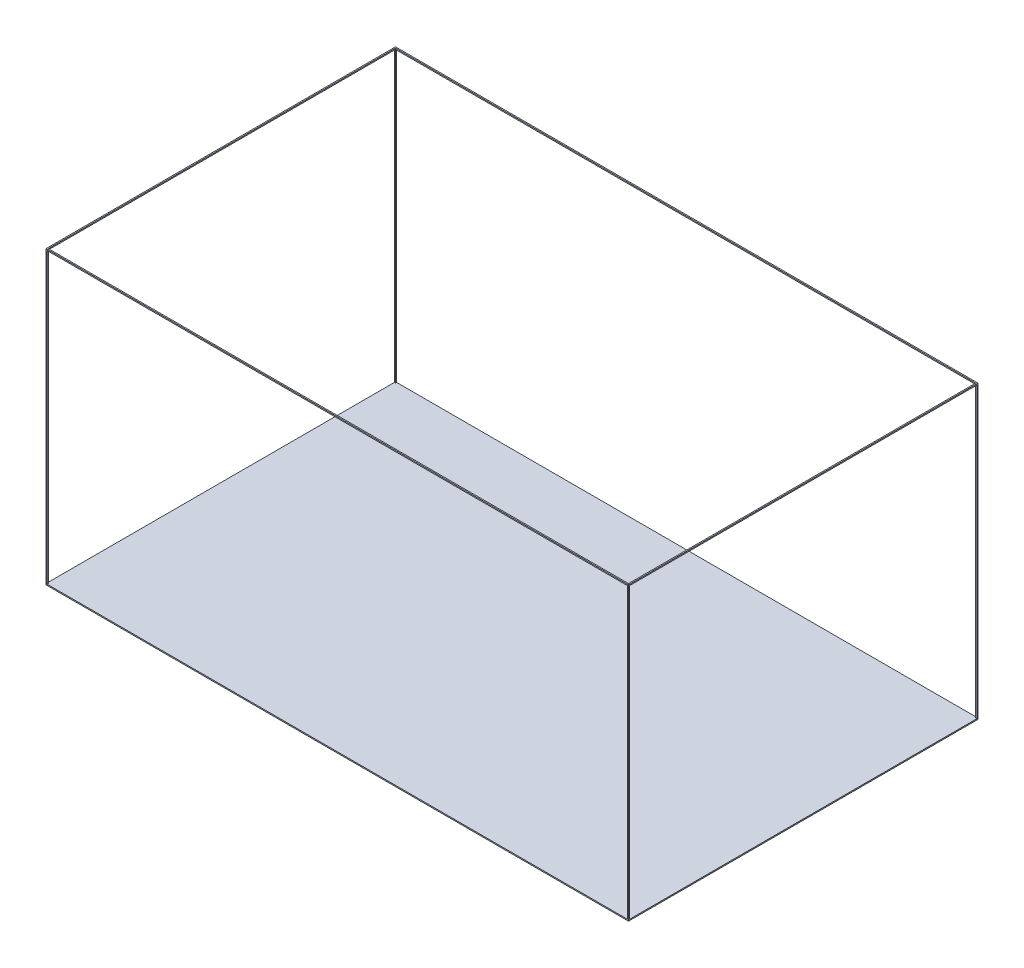
ISO-10303-21;
HEADER;
FILE_DESCRIPTION(('STEP AP214'),'2;1');
FILE_NAME('part.step','',(''),(''),'','','');
FILE_SCHEMA(('AUTOMOTIVE_DESIGN { 1 0 10303 214 1 1 1 1 }'));
ENDSEC;
DATA;
#1=APPLICATION_CONTEXT('core data for automotive mechanical design processes');
#2=APPLICATION_PROTOCOL_DEFINITION('international standard','automotive_design',2000,#1);
#3=PRODUCT_CONTEXT('',#1,'mechanical');
#4=PRODUCT('Part','Part','',(#3));
#5=PRODUCT_RELATED_PRODUCT_CATEGORY('part','',(#4));
#6=PRODUCT_DEFINITION_FORMATION('','',#4);
#7=PRODUCT_DEFINITION_CONTEXT('part definition',#1,'design');
#8=PRODUCT_DEFINITION('design','',#6,#7);
#9=PRODUCT_DEFINITION_SHAPE('','',#8);
#10=(LENGTH_UNIT() NAMED_UNIT(*) SI_UNIT(.MILLI.,.METRE.));
#11=(NAMED_UNIT(*) PLANE_ANGLE_UNIT() SI_UNIT($,.RADIAN.));
#12=(NAMED_UNIT(*) SI_UNIT($,.STERADIAN.) SOLID_ANGLE_UNIT());
#13=UNCERTAINTY_MEASURE_WITH_UNIT(LENGTH_MEASURE(1.E-05),#10,'distance_accuracy_value','');
#14=(GEOMETRIC_REPRESENTATION_CONTEXT(3) GLOBAL_UNCERTAINTY_ASSIGNED_CONTEXT((#13)) GLOBAL_UNIT_ASSIGNED_CONTEXT((#10,
#11,#12)) REPRESENTATION_CONTEXT('',''));
#15=CARTESIAN_POINT('',(0.,0.,0.));
#16=DIRECTION('',(0.,0.,1.));
#17=DIRECTION('',(1.,0.,0.));
#18=AXIS2_PLACEMENT_3D('',#15,#16,#17);
#19=CARTESIAN_POINT('',(-2490.,2500.,1500.));
#20=DIRECTION('',(1.,0.,0.));
#21=DIRECTION('',(0.,0.,-1.));
#22=AXIS2_PLACEMENT_3D('',#19,#20,#21);
#23=PLANE('',#22);
#24=DIRECTION('',(0.,-1.,0.));
#25=VECTOR('',#24,1.);
#26=CARTESIAN_POINT('',(-2490.,2500.,1490.));
#27=LINE('',#26,#25);
#28=CARTESIAN_POINT('',(-2490.,2490.,1490.));
#29=VERTEX_POINT('',#28);
#30=CARTESIAN_POINT('',(-2490.,9.99999999999979,1490.));
#31=VERTEX_POINT('',#30);
#32=EDGE_CURVE('E172',#29,#31,#27,.T.);
#33=ORIENTED_EDGE('',*,*,#32,.F.);
#34=DIRECTION('',(0.,0.,1.));
#35=VECTOR('',#34,1.);
#36=CARTESIAN_POINT('',(-2490.,2490.,-1500.));
#37=LINE('',#36,#35);
#38=CARTESIAN_POINT('',(-2490.,2490.,1500.));
#39=VERTEX_POINT('',#38);
#40=EDGE_CURVE('E278',#29,#39,#37,.T.);
#41=ORIENTED_EDGE('',*,*,#40,.T.);
#42=DIRECTION('',(0.,-1.,0.));
#43=VECTOR('',#42,1.);
#44=CARTESIAN_POINT('',(-2490.,2490.,1500.));
#45=LINE('',#44,#43);
#46=CARTESIAN_POINT('',(-2490.,9.99999999999979,1500.));
#47=VERTEX_POINT('',#46);
#48=EDGE_CURVE('E240',#39,#47,#45,.T.);
#49=ORIENTED_EDGE('',*,*,#48,.T.);
#50=DIRECTION('',(0.,0.,1.));
#51=VECTOR('',#50,1.);
#52=CARTESIAN_POINT('',(-2490.,9.99999999999979,1500.));
#53=LINE('',#52,#51);
#54=EDGE_CURVE('E286',#31,#47,#53,.T.);
#55=ORIENTED_EDGE('',*,*,#54,.F.);
#56=EDGE_LOOP('',(#33,#41,#49,#55));
#57=FACE_BOUND('',#56,.T.);
#58=ADVANCED_FACE('F38',(#57),#23,.T.);
#59=DIRECTION('',(0.,0.,1.));
#60=VECTOR('',#59,1.);
#61=CARTESIAN_POINT('',(-2490.,2490.,1500.));
#62=LINE('',#61,#60);
#63=CARTESIAN_POINT('',(-2490.,2490.,-1490.));
#64=VERTEX_POINT('',#63);
#65=EDGE_CURVE('E237',#64,#29,#62,.T.);
#66=ORIENTED_EDGE('',*,*,#65,.F.);
#67=DIRECTION('',(0.,-1.,0.));
#68=VECTOR('',#67,1.);
#69=CARTESIAN_POINT('',(-2490.,2500.,-1490.));
#70=LINE('',#69,#68);
#71=CARTESIAN_POINT('',(-2490.,2500.,-1490.));
#72=VERTEX_POINT('',#71);
#73=EDGE_CURVE('E297',#72,#64,#70,.T.);
#74=ORIENTED_EDGE('',*,*,#73,.F.);
#75=DIRECTION('',(0.,0.,1.));
#76=VECTOR('',#75,1.);
#77=CARTESIAN_POINT('',(-2490.,2500.,1500.));
#78=LINE('',#77,#76);
#79=CARTESIAN_POINT('',(-2490.,2500.,1490.));
#80=VERTEX_POINT('',#79);
#81=EDGE_CURVE('E310',#72,#80,#78,.T.);
#82=ORIENTED_EDGE('',*,*,#81,.T.);
#83=DIRECTION('',(0.,-1.,0.));
#84=VECTOR('',#83,1.);
#85=CARTESIAN_POINT('',(-2490.,2500.,1490.));
#86=LINE('',#85,#84);
#87=EDGE_CURVE('E291',#80,#29,#86,.T.);
#88=ORIENTED_EDGE('',*,*,#87,.T.);
#89=EDGE_LOOP('',(#66,#74,#82,#88));
#90=FACE_BOUND('',#89,.T.);
#91=ADVANCED_FACE('F397',(#90),#23,.T.);
#92=CARTESIAN_POINT('',(2490.,2500.,1500.));
#93=DIRECTION('',(-1.,0.,0.));
#94=DIRECTION('',(0.,0.,1.));
#95=AXIS2_PLACEMENT_3D('',#92,#93,#94);
#96=PLANE('',#95);
#97=DIRECTION('',(0.,1.,0.));
#98=VECTOR('',#97,1.);
#99=CARTESIAN_POINT('',(2490.,2500.,1490.));
#100=LINE('',#99,#98);
#101=CARTESIAN_POINT('',(2490.,10.,1490.));
#102=VERTEX_POINT('',#101);
#103=CARTESIAN_POINT('',(2490.,2490.,1490.));
#104=VERTEX_POINT('',#103);
#105=EDGE_CURVE('E214',#102,#104,#100,.T.);
#106=ORIENTED_EDGE('',*,*,#105,.F.);
#107=DIRECTION('',(0.,0.,-1.));
#108=VECTOR('',#107,1.);
#109=CARTESIAN_POINT('',(2490.,9.99999999999979,1500.));
#110=LINE('',#109,#108);
#111=CARTESIAN_POINT('',(2490.,10.,1500.));
#112=VERTEX_POINT('',#111);
#113=EDGE_CURVE('E306',#112,#102,#110,.T.);
#114=ORIENTED_EDGE('',*,*,#113,.F.);
#115=DIRECTION('',(0.,1.,0.));
#116=VECTOR('',#115,1.);
#117=CARTESIAN_POINT('',(2490.,10.,1500.));
#118=LINE('',#117,#116);
#119=CARTESIAN_POINT('',(2490.,2490.,1500.));
#120=VERTEX_POINT('',#119);
#121=EDGE_CURVE('E266',#112,#120,#118,.T.);
#122=ORIENTED_EDGE('',*,*,#121,.T.);
#123=DIRECTION('',(0.,0.,1.));
#124=VECTOR('',#123,1.);
#125=CARTESIAN_POINT('',(2490.,2490.,-1500.));
#126=LINE('',#125,#124);
#127=EDGE_CURVE('E258',#104,#120,#126,.T.);
#128=ORIENTED_EDGE('',*,*,#127,.F.);
#129=EDGE_LOOP('',(#106,#114,#122,#128));
#130=FACE_BOUND('',#129,.T.);
#131=ADVANCED_FACE('F403',(#130),#96,.T.);
#132=DIRECTION('',(0.,0.,-1.));
#133=VECTOR('',#132,1.);
#134=CARTESIAN_POINT('',(2490.,2490.,1500.));
#135=LINE('',#134,#133);
#136=CARTESIAN_POINT('',(2490.,2490.,-1490.));
#137=VERTEX_POINT('',#136);
#138=EDGE_CURVE('E234',#104,#137,#135,.T.);
#139=ORIENTED_EDGE('',*,*,#138,.F.);
#140=DIRECTION('',(0.,-1.,0.));
#141=VECTOR('',#140,1.);
#142=CARTESIAN_POINT('',(2490.,2500.,1490.));
#143=LINE('',#142,#141);
#144=CARTESIAN_POINT('',(2490.,2500.,1490.));
#145=VERTEX_POINT('',#144);
#146=EDGE_CURVE('E296',#145,#104,#143,.T.);
#147=ORIENTED_EDGE('',*,*,#146,.F.);
#148=DIRECTION('',(0.,0.,-1.));
#149=VECTOR('',#148,1.);
#150=CARTESIAN_POINT('',(2490.,2500.,1500.));
#151=LINE('',#150,#149);
#152=CARTESIAN_POINT('',(2490.,2500.,-1490.));
#153=VERTEX_POINT('',#152);
#154=EDGE_CURVE('E319',#145,#153,#151,.T.);
#155=ORIENTED_EDGE('',*,*,#154,.T.);
#156=DIRECTION('',(0.,-1.,0.));
#157=VECTOR('',#156,1.);
#158=CARTESIAN_POINT('',(2490.,2500.,-1490.));
#159=LINE('',#158,#157);
#160=EDGE_CURVE('E301',#153,#137,#159,.T.);
#161=ORIENTED_EDGE('',*,*,#160,.T.);
#162=EDGE_LOOP('',(#139,#147,#155,#161));
#163=FACE_BOUND('',#162,.T.);
#164=ADVANCED_FACE('F429',(#163),#96,.T.);
#165=CARTESIAN_POINT('',(-2500.,2500.,1500.));
#166=DIRECTION('',(1.,0.,0.));
#167=DIRECTION('',(0.,0.,-1.));
#168=AXIS2_PLACEMENT_3D('',#165,#166,#167);
#169=PLANE('',#168);
#170=DIRECTION('',(0.,0.,1.));
#171=VECTOR('',#170,1.);
#172=CARTESIAN_POINT('',(-2500.,2490.,-1490.));
#173=LINE('',#172,#171);
#174=CARTESIAN_POINT('',(-2500.,2490.,-1490.));
#175=VERTEX_POINT('',#174);
#176=CARTESIAN_POINT('',(-2500.,2490.,1490.));
#177=VERTEX_POINT('',#176);
#178=EDGE_CURVE('E189',#175,#177,#173,.T.);
#179=ORIENTED_EDGE('',*,*,#178,.T.);
#180=DIRECTION('',(0.,-1.,0.));
#181=VECTOR('',#180,1.);
#182=CARTESIAN_POINT('',(-2500.,2490.,1490.));
#183=LINE('',#182,#181);
#184=CARTESIAN_POINT('',(-2500.,10.,1490.));
#185=VERTEX_POINT('',#184);
#186=EDGE_CURVE('E169',#177,#185,#183,.T.);
#187=ORIENTED_EDGE('',*,*,#186,.T.);
#188=DIRECTION('',(0.,0.,-1.));
#189=VECTOR('',#188,1.);
#190=CARTESIAN_POINT('',(-2500.,10.,1490.));
#191=LINE('',#190,#189);
#192=CARTESIAN_POINT('',(-2500.,9.99999999999979,-1490.));
#193=VERTEX_POINT('',#192);
#194=EDGE_CURVE('E180',#185,#193,#191,.T.);
#195=ORIENTED_EDGE('',*,*,#194,.T.);
#196=DIRECTION('',(0.,1.,0.));
#197=VECTOR('',#196,1.);
#198=CARTESIAN_POINT('',(-2500.,10.,-1490.));
#199=LINE('',#198,#197);
#200=EDGE_CURVE('E54',#193,#175,#199,.T.);
#201=ORIENTED_EDGE('',*,*,#200,.T.);
#202=EDGE_LOOP('',(#179,#187,#195,#201));
#203=FACE_BOUND('',#202,.T.);
#204=DIRECTION('',(0.,0.,1.));
#205=VECTOR('',#204,1.);
#206=CARTESIAN_POINT('',(-2500.,0.,1500.));
#207=LINE('',#206,#205);
#208=CARTESIAN_POINT('',(-2500.,0.,-1500.));
#209=VERTEX_POINT('',#208);
#210=CARTESIAN_POINT('',(-2500.,0.,1500.));
#211=VERTEX_POINT('',#210);
#212=EDGE_CURVE('E295',#209,#211,#207,.T.);
#213=ORIENTED_EDGE('',*,*,#212,.T.);
#214=DIRECTION('',(0.,-1.,0.));
#215=VECTOR('',#214,1.);
#216=CARTESIAN_POINT('',(-2500.,2500.,1500.));
#217=LINE('',#216,#215);
#218=CARTESIAN_POINT('',(-2500.,2500.,1500.));
#219=VERTEX_POINT('',#218);
#220=EDGE_CURVE('E47',#219,#211,#217,.T.);
#221=ORIENTED_EDGE('',*,*,#220,.F.);
#222=DIRECTION('',(0.,0.,1.));
#223=VECTOR('',#222,1.);
#224=CARTESIAN_POINT('',(-2500.,2500.,1500.));
#225=LINE('',#224,#223);
#226=CARTESIAN_POINT('',(-2500.,2500.,-1500.));
#227=VERTEX_POINT('',#226);
#228=EDGE_CURVE('E325',#227,#219,#225,.T.);
#229=ORIENTED_EDGE('',*,*,#228,.F.);
#230=DIRECTION('',(0.,-1.,0.));
#231=VECTOR('',#230,1.);
#232=CARTESIAN_POINT('',(-2500.,2500.,-1500.));
#233=LINE('',#232,#231);
#234=EDGE_CURVE('E339',#227,#209,#233,.T.);
#235=ORIENTED_EDGE('',*,*,#234,.T.);
#236=EDGE_LOOP('',(#213,#221,#229,#235));
#237=FACE_BOUND('',#236,.T.);
#238=ADVANCED_FACE('F40',(#203,#237),#169,.F.);
#239=CARTESIAN_POINT('',(2500.,2500.,1500.));
#240=DIRECTION('',(0.,0.,-1.));
#241=DIRECTION('',(-1.,0.,0.));
#242=AXIS2_PLACEMENT_3D('',#239,#240,#241);
#243=PLANE('',#242);
#244=DIRECTION('',(1.,0.,0.));
#245=VECTOR('',#244,1.);
#246=CARTESIAN_POINT('',(-2490.,10.,1500.));
#247=LINE('',#246,#245);
#248=EDGE_CURVE('E262',#47,#112,#247,.T.);
#249=ORIENTED_EDGE('',*,*,#248,.F.);
#250=ORIENTED_EDGE('',*,*,#48,.F.);
#251=DIRECTION('',(-1.,0.,0.));
#252=VECTOR('',#251,1.);
#253=CARTESIAN_POINT('',(2490.,2490.,1500.));
#254=LINE('',#253,#252);
#255=EDGE_CURVE('E246',#120,#39,#254,.T.);
#256=ORIENTED_EDGE('',*,*,#255,.F.);
#257=ORIENTED_EDGE('',*,*,#121,.F.);
#258=EDGE_LOOP('',(#249,#250,#256,#257));
#259=FACE_BOUND('',#258,.T.);
#260=DIRECTION('',(1.,0.,0.));
#261=VECTOR('',#260,1.);
#262=CARTESIAN_POINT('',(2500.,0.,1500.));
#263=LINE('',#262,#261);
#264=CARTESIAN_POINT('',(2500.,0.,1500.));
#265=VERTEX_POINT('',#264);
#266=EDGE_CURVE('E343',#211,#265,#263,.T.);
#267=ORIENTED_EDGE('',*,*,#266,.T.);
#268=DIRECTION('',(0.,-1.,0.));
#269=VECTOR('',#268,1.);
#270=CARTESIAN_POINT('',(2500.,2500.,1500.));
#271=LINE('',#270,#269);
#272=CARTESIAN_POINT('',(2500.,2500.,1500.));
#273=VERTEX_POINT('',#272);
#274=EDGE_CURVE('E358',#273,#265,#271,.T.);
#275=ORIENTED_EDGE('',*,*,#274,.F.);
#276=DIRECTION('',(1.,0.,0.));
#277=VECTOR('',#276,1.);
#278=CARTESIAN_POINT('',(2500.,2500.,1500.));
#279=LINE('',#278,#277);
#280=EDGE_CURVE('E329',#219,#273,#279,.T.);
#281=ORIENTED_EDGE('',*,*,#280,.F.);
#282=ORIENTED_EDGE('',*,*,#220,.T.);
#283=EDGE_LOOP('',(#267,#275,#281,#282));
#284=FACE_BOUND('',#283,.T.);
#285=ADVANCED_FACE('F365',(#259,#284),#243,.F.);
#286=CARTESIAN_POINT('',(2500.,2500.,1500.));
#287=DIRECTION('',(-1.,0.,0.));
#288=DIRECTION('',(0.,0.,1.));
#289=AXIS2_PLACEMENT_3D('',#286,#287,#288);
#290=PLANE('',#289);
#291=DIRECTION('',(0.,0.,-1.));
#292=VECTOR('',#291,1.);
#293=CARTESIAN_POINT('',(2500.,10.,1490.));
#294=LINE('',#293,#292);
#295=CARTESIAN_POINT('',(2500.,9.99999999999979,1490.));
#296=VERTEX_POINT('',#295);
#297=CARTESIAN_POINT('',(2500.,10.,-1490.));
#298=VERTEX_POINT('',#297);
#299=EDGE_CURVE('E204',#296,#298,#294,.T.);
#300=ORIENTED_EDGE('',*,*,#299,.F.);
#301=DIRECTION('',(0.,-1.,0.));
#302=VECTOR('',#301,1.);
#303=CARTESIAN_POINT('',(2500.,2490.,1490.));
#304=LINE('',#303,#302);
#305=CARTESIAN_POINT('',(2500.,2490.,1490.));
#306=VERTEX_POINT('',#305);
#307=EDGE_CURVE('E62',#306,#296,#304,.T.);
#308=ORIENTED_EDGE('',*,*,#307,.F.);
#309=DIRECTION('',(0.,0.,1.));
#310=VECTOR('',#309,1.);
#311=CARTESIAN_POINT('',(2500.,2490.,-1490.));
#312=LINE('',#311,#310);
#313=CARTESIAN_POINT('',(2500.,2490.,-1490.));
#314=VERTEX_POINT('',#313);
#315=EDGE_CURVE('E191',#314,#306,#312,.T.);
#316=ORIENTED_EDGE('',*,*,#315,.F.);
#317=DIRECTION('',(0.,1.,0.));
#318=VECTOR('',#317,1.);
#319=CARTESIAN_POINT('',(2500.,10.,-1490.));
#320=LINE('',#319,#318);
#321=EDGE_CURVE('E195',#298,#314,#320,.T.);
#322=ORIENTED_EDGE('',*,*,#321,.F.);
#323=EDGE_LOOP('',(#300,#308,#316,#322));
#324=FACE_BOUND('',#323,.T.);
#325=DIRECTION('',(0.,0.,-1.));
#326=VECTOR('',#325,1.);
#327=CARTESIAN_POINT('',(2500.,0.,1500.));
#328=LINE('',#327,#326);
#329=CARTESIAN_POINT('',(2500.,0.,-1500.));
#330=VERTEX_POINT('',#329);
#331=EDGE_CURVE('E346',#265,#330,#328,.T.);
#332=ORIENTED_EDGE('',*,*,#331,.T.);
#333=DIRECTION('',(0.,-1.,0.));
#334=VECTOR('',#333,1.);
#335=CARTESIAN_POINT('',(2500.,2500.,-1500.));
#336=LINE('',#335,#334);
#337=CARTESIAN_POINT('',(2500.,2500.,-1500.));
#338=VERTEX_POINT('',#337);
#339=EDGE_CURVE('E354',#338,#330,#336,.T.);
#340=ORIENTED_EDGE('',*,*,#339,.F.);
#341=DIRECTION('',(0.,0.,-1.));
#342=VECTOR('',#341,1.);
#343=CARTESIAN_POINT('',(2500.,2500.,1500.));
#344=LINE('',#343,#342);
#345=EDGE_CURVE('E333',#273,#338,#344,.T.);
#346=ORIENTED_EDGE('',*,*,#345,.F.);
#347=ORIENTED_EDGE('',*,*,#274,.T.);
#348=EDGE_LOOP('',(#332,#340,#346,#347));
#349=FACE_BOUND('',#348,.T.);
#350=ADVANCED_FACE('F376',(#324,#349),#290,.F.);
#351=CARTESIAN_POINT('',(2500.,2500.,-1500.));
#352=DIRECTION('',(0.,0.,1.));
#353=DIRECTION('',(1.,0.,0.));
#354=AXIS2_PLACEMENT_3D('',#351,#352,#353);
#355=PLANE('',#354);
#356=DIRECTION('',(-1.,0.,0.));
#357=VECTOR('',#356,1.);
#358=CARTESIAN_POINT('',(2490.,2490.,-1500.));
#359=LINE('',#358,#357);
#360=CARTESIAN_POINT('',(2490.,2490.,-1500.));
#361=VERTEX_POINT('',#360);
#362=CARTESIAN_POINT('',(-2490.,2490.,-1500.));
#363=VERTEX_POINT('',#362);
#364=EDGE_CURVE('E254',#361,#363,#359,.T.);
#365=ORIENTED_EDGE('',*,*,#364,.T.);
#366=DIRECTION('',(0.,-1.,0.));
#367=VECTOR('',#366,1.);
#368=CARTESIAN_POINT('',(-2490.,2490.,-1500.));
#369=LINE('',#368,#367);
#370=CARTESIAN_POINT('',(-2490.,10.,-1500.));
#371=VERTEX_POINT('',#370);
#372=EDGE_CURVE('E241',#363,#371,#369,.T.);
#373=ORIENTED_EDGE('',*,*,#372,.T.);
#374=DIRECTION('',(1.,0.,0.));
#375=VECTOR('',#374,1.);
#376=CARTESIAN_POINT('',(-2490.,10.,-1500.));
#377=LINE('',#376,#375);
#378=CARTESIAN_POINT('',(2490.,9.99999999999979,-1500.));
#379=VERTEX_POINT('',#378);
#380=EDGE_CURVE('E245',#371,#379,#377,.T.);
#381=ORIENTED_EDGE('',*,*,#380,.T.);
#382=DIRECTION('',(0.,1.,0.));
#383=VECTOR('',#382,1.);
#384=CARTESIAN_POINT('',(2490.,10.,-1500.));
#385=LINE('',#384,#383);
#386=EDGE_CURVE('E250',#379,#361,#385,.T.);
#387=ORIENTED_EDGE('',*,*,#386,.T.);
#388=EDGE_LOOP('',(#365,#373,#381,#387));
#389=FACE_BOUND('',#388,.T.);
#390=DIRECTION('',(-1.,0.,0.));
#391=VECTOR('',#390,1.);
#392=CARTESIAN_POINT('',(2500.,0.,-1500.));
#393=LINE('',#392,#391);
#394=EDGE_CURVE('E330',#330,#209,#393,.T.);
#395=ORIENTED_EDGE('',*,*,#394,.T.);
#396=ORIENTED_EDGE('',*,*,#234,.F.);
#397=DIRECTION('',(-1.,0.,0.));
#398=VECTOR('',#397,1.);
#399=CARTESIAN_POINT('',(2500.,2500.,-1500.));
#400=LINE('',#399,#398);
#401=EDGE_CURVE('E336',#338,#227,#400,.T.);
#402=ORIENTED_EDGE('',*,*,#401,.F.);
#403=ORIENTED_EDGE('',*,*,#339,.T.);
#404=EDGE_LOOP('',(#395,#396,#402,#403));
#405=FACE_BOUND('',#404,.T.);
#406=ADVANCED_FACE('F380',(#389,#405),#355,.F.);
#407=CARTESIAN_POINT('',(0.,2500.,0.));
#408=DIRECTION('',(0.,1.,0.));
#409=DIRECTION('',(0.,0.,1.));
#410=AXIS2_PLACEMENT_3D('',#407,#408,#409);
#411=PLANE('',#410);
#412=ORIENTED_EDGE('',*,*,#81,.F.);
#413=DIRECTION('',(-1.,0.,0.));
#414=VECTOR('',#413,1.);
#415=CARTESIAN_POINT('',(2500.,2500.,-1490.));
#416=LINE('',#415,#414);
#417=EDGE_CURVE('E302',#153,#72,#416,.T.);
#418=ORIENTED_EDGE('',*,*,#417,.F.);
#419=ORIENTED_EDGE('',*,*,#154,.F.);
#420=DIRECTION('',(1.,0.,0.));
#421=VECTOR('',#420,1.);
#422=CARTESIAN_POINT('',(2500.,2500.,1490.));
#423=LINE('',#422,#421);
#424=EDGE_CURVE('E316',#80,#145,#423,.T.);
#425=ORIENTED_EDGE('',*,*,#424,.F.);
#426=EDGE_LOOP('',(#412,#418,#419,#425));
#427=FACE_BOUND('',#426,.T.);
#428=ORIENTED_EDGE('',*,*,#228,.T.);
#429=ORIENTED_EDGE('',*,*,#280,.T.);
#430=ORIENTED_EDGE('',*,*,#345,.T.);
#431=ORIENTED_EDGE('',*,*,#401,.T.);
#432=EDGE_LOOP('',(#428,#429,#430,#431));
#433=FACE_BOUND('',#432,.T.);
#434=ADVANCED_FACE('F382',(#427,#433),#411,.T.);
#435=CARTESIAN_POINT('',(0.,0.,0.));
#436=DIRECTION('',(0.,1.,0.));
#437=DIRECTION('',(0.,0.,1.));
#438=AXIS2_PLACEMENT_3D('',#435,#436,#437);
#439=PLANE('',#438);
#440=ORIENTED_EDGE('',*,*,#212,.F.);
#441=ORIENTED_EDGE('',*,*,#394,.F.);
#442=ORIENTED_EDGE('',*,*,#331,.F.);
#443=ORIENTED_EDGE('',*,*,#266,.F.);
#444=EDGE_LOOP('',(#440,#441,#442,#443));
#445=FACE_BOUND('',#444,.T.);
#446=ADVANCED_FACE('F372',(#445),#439,.F.);
#447=DIRECTION('',(0.,1.,0.));
#448=VECTOR('',#447,1.);
#449=CARTESIAN_POINT('',(-2490.,2500.,-1490.));
#450=LINE('',#449,#448);
#451=CARTESIAN_POINT('',(-2490.,10.,-1490.));
#452=VERTEX_POINT('',#451);
#453=EDGE_CURVE('E231',#452,#64,#450,.T.);
#454=ORIENTED_EDGE('',*,*,#453,.F.);
#455=EDGE_CURVE('E287',#371,#452,#53,.T.);
#456=ORIENTED_EDGE('',*,*,#455,.F.);
#457=ORIENTED_EDGE('',*,*,#372,.F.);
#458=EDGE_CURVE('E273',#363,#64,#37,.T.);
#459=ORIENTED_EDGE('',*,*,#458,.T.);
#460=EDGE_LOOP('',(#454,#456,#457,#459));
#461=FACE_BOUND('',#460,.T.);
#462=ADVANCED_FACE('F390',(#461),#23,.T.);
#463=CARTESIAN_POINT('',(2500.,2500.,1490.));
#464=DIRECTION('',(0.,0.,-1.));
#465=DIRECTION('',(-1.,0.,0.));
#466=AXIS2_PLACEMENT_3D('',#463,#464,#465);
#467=PLANE('',#466);
#468=DIRECTION('',(1.,0.,0.));
#469=VECTOR('',#468,1.);
#470=CARTESIAN_POINT('',(2500.,2490.,1490.));
#471=LINE('',#470,#469);
#472=EDGE_CURVE('E277',#29,#104,#471,.T.);
#473=ORIENTED_EDGE('',*,*,#472,.F.);
#474=ORIENTED_EDGE('',*,*,#87,.F.);
#475=ORIENTED_EDGE('',*,*,#424,.T.);
#476=ORIENTED_EDGE('',*,*,#146,.T.);
#477=EDGE_LOOP('',(#473,#474,#475,#476));
#478=FACE_BOUND('',#477,.T.);
#479=ADVANCED_FACE('F408',(#478),#467,.T.);
#480=DIRECTION('',(0.,-1.,0.));
#481=VECTOR('',#480,1.);
#482=CARTESIAN_POINT('',(2490.,2500.,-1490.));
#483=LINE('',#482,#481);
#484=CARTESIAN_POINT('',(2490.,9.99999999999979,-1490.));
#485=VERTEX_POINT('',#484);
#486=EDGE_CURVE('E227',#137,#485,#483,.T.);
#487=ORIENTED_EDGE('',*,*,#486,.F.);
#488=EDGE_CURVE('E279',#361,#137,#126,.T.);
#489=ORIENTED_EDGE('',*,*,#488,.F.);
#490=ORIENTED_EDGE('',*,*,#386,.F.);
#491=EDGE_CURVE('E290',#485,#379,#110,.T.);
#492=ORIENTED_EDGE('',*,*,#491,.F.);
#493=EDGE_LOOP('',(#487,#489,#490,#492));
#494=FACE_BOUND('',#493,.T.);
#495=ADVANCED_FACE('F413',(#494),#96,.T.);
#496=CARTESIAN_POINT('',(2500.,2500.,-1490.));
#497=DIRECTION('',(0.,0.,1.));
#498=DIRECTION('',(1.,0.,0.));
#499=AXIS2_PLACEMENT_3D('',#496,#497,#498);
#500=PLANE('',#499);
#501=DIRECTION('',(-1.,0.,0.));
#502=VECTOR('',#501,1.);
#503=CARTESIAN_POINT('',(2500.,2490.,-1490.));
#504=LINE('',#503,#502);
#505=EDGE_CURVE('E11',#137,#64,#504,.T.);
#506=ORIENTED_EDGE('',*,*,#505,.F.);
#507=ORIENTED_EDGE('',*,*,#160,.F.);
#508=ORIENTED_EDGE('',*,*,#417,.T.);
#509=ORIENTED_EDGE('',*,*,#73,.T.);
#510=EDGE_LOOP('',(#506,#507,#508,#509));
#511=FACE_BOUND('',#510,.T.);
#512=ADVANCED_FACE('F425',(#511),#500,.T.);
#513=CARTESIAN_POINT('',(0.,10.,0.));
#514=DIRECTION('',(0.,1.,0.));
#515=DIRECTION('',(0.,0.,1.));
#516=AXIS2_PLACEMENT_3D('',#513,#514,#515);
#517=PLANE('',#516);
#518=ORIENTED_EDGE('',*,*,#455,.T.);
#519=DIRECTION('',(1.,0.,0.));
#520=VECTOR('',#519,1.);
#521=CARTESIAN_POINT('',(-2500.,10.,-1490.));
#522=LINE('',#521,#520);
#523=EDGE_CURVE('E183',#193,#452,#522,.T.);
#524=ORIENTED_EDGE('',*,*,#523,.F.);
#525=ORIENTED_EDGE('',*,*,#194,.F.);
#526=DIRECTION('',(1.,0.,0.));
#527=VECTOR('',#526,1.);
#528=CARTESIAN_POINT('',(-2500.,10.,1490.));
#529=LINE('',#528,#527);
#530=EDGE_CURVE('E164',#185,#31,#529,.T.);
#531=ORIENTED_EDGE('',*,*,#530,.T.);
#532=ORIENTED_EDGE('',*,*,#54,.T.);
#533=ORIENTED_EDGE('',*,*,#248,.T.);
#534=ORIENTED_EDGE('',*,*,#113,.T.);
#535=EDGE_CURVE('E177',#102,#296,#529,.T.);
#536=ORIENTED_EDGE('',*,*,#535,.T.);
#537=ORIENTED_EDGE('',*,*,#299,.T.);
#538=EDGE_CURVE('E176',#485,#298,#522,.T.);
#539=ORIENTED_EDGE('',*,*,#538,.F.);
#540=ORIENTED_EDGE('',*,*,#491,.T.);
#541=ORIENTED_EDGE('',*,*,#380,.F.);
#542=EDGE_LOOP('',(#518,#524,#525,#531,#532,#533,#534,#536,#537,#539,#540,#541));
#543=FACE_BOUND('',#542,.T.);
#544=ADVANCED_FACE('F182',(#543),#517,.T.);
#545=CARTESIAN_POINT('',(2490.,2490.,-1500.));
#546=DIRECTION('',(0.,1.,0.));
#547=DIRECTION('',(0.,0.,1.));
#548=AXIS2_PLACEMENT_3D('',#545,#546,#547);
#549=PLANE('',#548);
#550=ORIENTED_EDGE('',*,*,#505,.T.);
#551=ORIENTED_EDGE('',*,*,#458,.F.);
#552=ORIENTED_EDGE('',*,*,#364,.F.);
#553=ORIENTED_EDGE('',*,*,#488,.T.);
#554=EDGE_LOOP('',(#550,#551,#552,#553));
#555=FACE_BOUND('',#554,.T.);
#556=ADVANCED_FACE('F422',(#555),#549,.F.);
#557=ORIENTED_EDGE('',*,*,#472,.T.);
#558=ORIENTED_EDGE('',*,*,#127,.T.);
#559=ORIENTED_EDGE('',*,*,#255,.T.);
#560=ORIENTED_EDGE('',*,*,#40,.F.);
#561=EDGE_LOOP('',(#557,#558,#559,#560));
#562=FACE_BOUND('',#561,.T.);
#563=ADVANCED_FACE('F441',(#562),#549,.F.);
#564=CARTESIAN_POINT('',(-2500.,10.,-1490.));
#565=DIRECTION('',(0.,0.,-1.));
#566=DIRECTION('',(-1.,0.,0.));
#567=AXIS2_PLACEMENT_3D('',#564,#565,#566);
#568=PLANE('',#567);
#569=ORIENTED_EDGE('',*,*,#486,.T.);
#570=ORIENTED_EDGE('',*,*,#538,.T.);
#571=ORIENTED_EDGE('',*,*,#321,.T.);
#572=DIRECTION('',(1.,0.,0.));
#573=VECTOR('',#572,1.);
#574=CARTESIAN_POINT('',(-2500.,2490.,-1490.));
#575=LINE('',#574,#573);
#576=EDGE_CURVE('E220',#137,#314,#575,.T.);
#577=ORIENTED_EDGE('',*,*,#576,.F.);
#578=EDGE_LOOP('',(#569,#570,#571,#577));
#579=FACE_BOUND('',#578,.T.);
#580=ADVANCED_FACE('F458',(#579),#568,.F.);
#581=CARTESIAN_POINT('',(-2500.,2490.,-1490.));
#582=DIRECTION('',(0.,1.,0.));
#583=DIRECTION('',(0.,0.,1.));
#584=AXIS2_PLACEMENT_3D('',#581,#582,#583);
#585=PLANE('',#584);
#586=ORIENTED_EDGE('',*,*,#138,.T.);
#587=ORIENTED_EDGE('',*,*,#576,.T.);
#588=ORIENTED_EDGE('',*,*,#315,.T.);
#589=DIRECTION('',(1.,0.,0.));
#590=VECTOR('',#589,1.);
#591=CARTESIAN_POINT('',(-2500.,2490.,1490.));
#592=LINE('',#591,#590);
#593=EDGE_CURVE('E215',#104,#306,#592,.T.);
#594=ORIENTED_EDGE('',*,*,#593,.F.);
#595=EDGE_LOOP('',(#586,#587,#588,#594));
#596=FACE_BOUND('',#595,.T.);
#597=ADVANCED_FACE('F470',(#596),#585,.F.);
#598=CARTESIAN_POINT('',(-2500.,2490.,1490.));
#599=DIRECTION('',(0.,0.,1.));
#600=DIRECTION('',(1.,0.,0.));
#601=AXIS2_PLACEMENT_3D('',#598,#599,#600);
#602=PLANE('',#601);
#603=ORIENTED_EDGE('',*,*,#105,.T.);
#604=ORIENTED_EDGE('',*,*,#593,.T.);
#605=ORIENTED_EDGE('',*,*,#307,.T.);
#606=ORIENTED_EDGE('',*,*,#535,.F.);
#607=EDGE_LOOP('',(#603,#604,#605,#606));
#608=FACE_BOUND('',#607,.T.);
#609=ADVANCED_FACE('F468',(#608),#602,.F.);
#610=ORIENTED_EDGE('',*,*,#65,.T.);
#611=EDGE_CURVE('E211',#177,#29,#592,.T.);
#612=ORIENTED_EDGE('',*,*,#611,.F.);
#613=ORIENTED_EDGE('',*,*,#178,.F.);
#614=EDGE_CURVE('E216',#175,#64,#575,.T.);
#615=ORIENTED_EDGE('',*,*,#614,.T.);
#616=EDGE_LOOP('',(#610,#612,#613,#615));
#617=FACE_BOUND('',#616,.T.);
#618=ADVANCED_FACE('F437',(#617),#585,.F.);
#619=ORIENTED_EDGE('',*,*,#453,.T.);
#620=ORIENTED_EDGE('',*,*,#614,.F.);
#621=ORIENTED_EDGE('',*,*,#200,.F.);
#622=ORIENTED_EDGE('',*,*,#523,.T.);
#623=EDGE_LOOP('',(#619,#620,#621,#622));
#624=FACE_BOUND('',#623,.T.);
#625=ADVANCED_FACE('F479',(#624),#568,.F.);
#626=ORIENTED_EDGE('',*,*,#32,.T.);
#627=ORIENTED_EDGE('',*,*,#530,.F.);
#628=ORIENTED_EDGE('',*,*,#186,.F.);
#629=ORIENTED_EDGE('',*,*,#611,.T.);
#630=EDGE_LOOP('',(#626,#627,#628,#629));
#631=FACE_BOUND('',#630,.T.);
#632=ADVANCED_FACE('F166',(#631),#602,.F.);
#633=CLOSED_SHELL('',(#58,#91,#131,#164,#238,#285,#350,#406,#434,#446,#462,#479,#495,#512,#544,
#556,#563,#580,#597,#609,#618,#625,#632));
#634=MANIFOLD_SOLID_BREP('B2',#633);
#635=ADVANCED_BREP_SHAPE_REPRESENTATION('',(#18,#634),#14);
#636=SHAPE_DEFINITION_REPRESENTATION(#9,#635);
ENDSEC;
END-ISO-10303-21;
